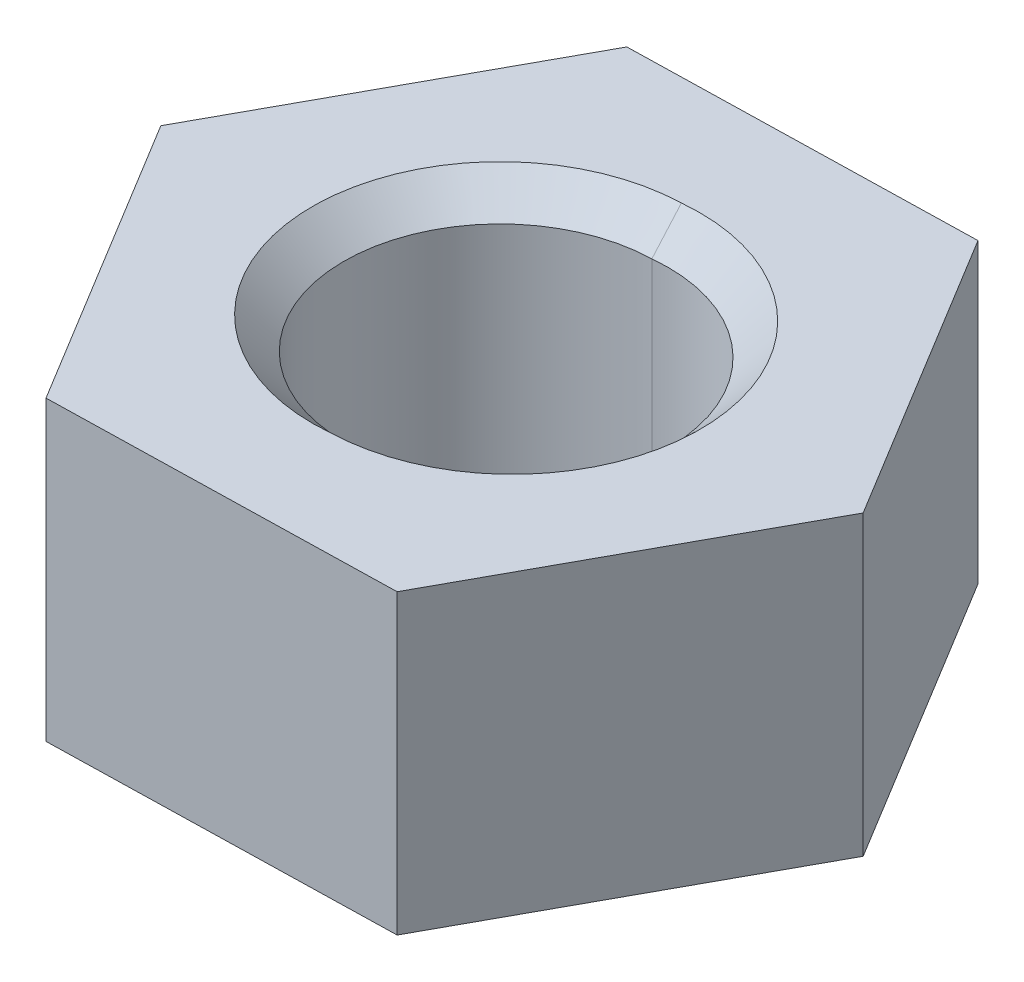
ISO-10303-21;
HEADER;
FILE_DESCRIPTION(('STEP AP214'),'2;1');
FILE_NAME('part.step','',(''),(''),'','','');
FILE_SCHEMA(('AUTOMOTIVE_DESIGN { 1 0 10303 214 1 1 1 1 }'));
ENDSEC;
DATA;
#1=APPLICATION_CONTEXT('core data for automotive mechanical design processes');
#2=APPLICATION_PROTOCOL_DEFINITION('international standard','automotive_design',2000,#1);
#3=PRODUCT_CONTEXT('',#1,'mechanical');
#4=PRODUCT('Part','Part','',(#3));
#5=PRODUCT_RELATED_PRODUCT_CATEGORY('part','',(#4));
#6=PRODUCT_DEFINITION_FORMATION('','',#4);
#7=PRODUCT_DEFINITION_CONTEXT('part definition',#1,'design');
#8=PRODUCT_DEFINITION('design','',#6,#7);
#9=PRODUCT_DEFINITION_SHAPE('','',#8);
#10=(LENGTH_UNIT() NAMED_UNIT(*) SI_UNIT(.MILLI.,.METRE.));
#11=(NAMED_UNIT(*) PLANE_ANGLE_UNIT() SI_UNIT($,.RADIAN.));
#12=(NAMED_UNIT(*) SI_UNIT($,.STERADIAN.) SOLID_ANGLE_UNIT());
#13=UNCERTAINTY_MEASURE_WITH_UNIT(LENGTH_MEASURE(1.E-05),#10,'distance_accuracy_value','');
#14=(GEOMETRIC_REPRESENTATION_CONTEXT(3) GLOBAL_UNCERTAINTY_ASSIGNED_CONTEXT((#13)) GLOBAL_UNIT_ASSIGNED_CONTEXT((#10,
#11,#12)) REPRESENTATION_CONTEXT('',''));
#15=CARTESIAN_POINT('',(0.,0.,0.));
#16=DIRECTION('',(0.,0.,1.));
#17=DIRECTION('',(1.,0.,0.));
#18=AXIS2_PLACEMENT_3D('',#15,#16,#17);
#19=CARTESIAN_POINT('',(-2.21675251568227,4.,4.05207867859814));
#20=DIRECTION('',(-0.0230092875344841,0.,-0.99973525129764));
#21=DIRECTION('',(-0.99973525129764,0.,0.0230092875344841));
#22=AXIS2_PLACEMENT_3D('',#19,#20,#21);
#23=PLANE('',#22);
#24=DIRECTION('',(0.99973525129764,0.,-0.0230092875344841));
#25=VECTOR('',#24,1.);
#26=CARTESIAN_POINT('',(-2.21675251568227,0.,4.05207867859814));
#27=LINE('',#26,#25);
#28=CARTESIAN_POINT('',(-2.21675251568227,0.,4.05207867859814));
#29=VERTEX_POINT('',#28);
#30=CARTESIAN_POINT('',(2.40082681595814,0.,3.94580333178298));
#31=VERTEX_POINT('',#30);
#32=EDGE_CURVE('E156',#29,#31,#27,.T.);
#33=ORIENTED_EDGE('',*,*,#32,.T.);
#34=DIRECTION('',(0.,-1.,0.));
#35=VECTOR('',#34,1.);
#36=CARTESIAN_POINT('',(2.40082681595814,4.,3.94580333178298));
#37=LINE('',#36,#35);
#38=CARTESIAN_POINT('',(2.40082681595814,4.,3.94580333178298));
#39=VERTEX_POINT('',#38);
#40=EDGE_CURVE('E185',#39,#31,#37,.T.);
#41=ORIENTED_EDGE('',*,*,#40,.F.);
#42=DIRECTION('',(0.99973525129764,0.,-0.0230092875344841));
#43=VECTOR('',#42,1.);
#44=CARTESIAN_POINT('',(-2.21675251568227,4.,4.05207867859814));
#45=LINE('',#44,#43);
#46=CARTESIAN_POINT('',(-2.21675251568227,4.,4.05207867859814));
#47=VERTEX_POINT('',#46);
#48=EDGE_CURVE('E174',#47,#39,#45,.T.);
#49=ORIENTED_EDGE('',*,*,#48,.F.);
#50=DIRECTION('',(0.,-1.,0.));
#51=VECTOR('',#50,1.);
#52=CARTESIAN_POINT('',(-2.21675251568227,4.,4.05207867859814));
#53=LINE('',#52,#51);
#54=EDGE_CURVE('E152',#47,#29,#53,.T.);
#55=ORIENTED_EDGE('',*,*,#54,.T.);
#56=EDGE_LOOP('',(#33,#41,#49,#55));
#57=FACE_BOUND('',#56,.T.);
#58=ADVANCED_FACE('F49',(#57),#23,.F.);
#59=CARTESIAN_POINT('',(2.40082681595814,4.,3.94580333178298));
#60=DIRECTION('',(-0.877300768449818,0.,-0.479940998120976));
#61=DIRECTION('',(-0.479940998120976,0.,0.877300768449818));
#62=AXIS2_PLACEMENT_3D('',#59,#60,#61);
#63=PLANE('',#62);
#64=DIRECTION('',(0.479940998120976,0.,-0.877300768449818));
#65=VECTOR('',#64,1.);
#66=CARTESIAN_POINT('',(2.40082681595814,0.,3.94580333178298));
#67=LINE('',#66,#65);
#68=CARTESIAN_POINT('',(4.6175793316404,0.,-0.106275346815166));
#69=VERTEX_POINT('',#68);
#70=EDGE_CURVE('E160',#31,#69,#67,.T.);
#71=ORIENTED_EDGE('',*,*,#70,.T.);
#72=DIRECTION('',(0.,-1.,0.));
#73=VECTOR('',#72,1.);
#74=CARTESIAN_POINT('',(4.6175793316404,4.,-0.106275346815166));
#75=LINE('',#74,#73);
#76=CARTESIAN_POINT('',(4.6175793316404,4.,-0.106275346815166));
#77=VERTEX_POINT('',#76);
#78=EDGE_CURVE('E181',#77,#69,#75,.T.);
#79=ORIENTED_EDGE('',*,*,#78,.F.);
#80=DIRECTION('',(0.479940998120976,0.,-0.877300768449818));
#81=VECTOR('',#80,1.);
#82=CARTESIAN_POINT('',(2.40082681595814,4.,3.94580333178298));
#83=LINE('',#82,#81);
#84=EDGE_CURVE('E115',#39,#77,#83,.T.);
#85=ORIENTED_EDGE('',*,*,#84,.F.);
#86=ORIENTED_EDGE('',*,*,#40,.T.);
#87=EDGE_LOOP('',(#71,#79,#85,#86));
#88=FACE_BOUND('',#87,.T.);
#89=ADVANCED_FACE('F208',(#88),#63,.F.);
#90=CARTESIAN_POINT('',(4.6175793316404,4.,-0.106275346815166));
#91=DIRECTION('',(-0.854291480915334,0.,0.519794253176664));
#92=DIRECTION('',(0.519794253176664,0.,0.854291480915334));
#93=AXIS2_PLACEMENT_3D('',#90,#91,#92);
#94=PLANE('',#93);
#95=DIRECTION('',(-0.519794253176664,0.,-0.854291480915334));
#96=VECTOR('',#95,1.);
#97=CARTESIAN_POINT('',(4.6175793316404,0.,-0.106275346815166));
#98=LINE('',#97,#96);
#99=CARTESIAN_POINT('',(2.21675251568227,0.,-4.05207867859814));
#100=VERTEX_POINT('',#99);
#101=EDGE_CURVE('E164',#69,#100,#98,.T.);
#102=ORIENTED_EDGE('',*,*,#101,.T.);
#103=DIRECTION('',(0.,-1.,0.));
#104=VECTOR('',#103,1.);
#105=CARTESIAN_POINT('',(2.21675251568227,4.,-4.05207867859814));
#106=LINE('',#105,#104);
#107=CARTESIAN_POINT('',(2.21675251568227,4.,-4.05207867859814));
#108=VERTEX_POINT('',#107);
#109=EDGE_CURVE('E145',#108,#100,#106,.T.);
#110=ORIENTED_EDGE('',*,*,#109,.F.);
#111=DIRECTION('',(-0.519794253176664,0.,-0.854291480915334));
#112=VECTOR('',#111,1.);
#113=CARTESIAN_POINT('',(4.6175793316404,4.,-0.106275346815166));
#114=LINE('',#113,#112);
#115=EDGE_CURVE('E131',#77,#108,#114,.T.);
#116=ORIENTED_EDGE('',*,*,#115,.F.);
#117=ORIENTED_EDGE('',*,*,#78,.T.);
#118=EDGE_LOOP('',(#102,#110,#116,#117));
#119=FACE_BOUND('',#118,.T.);
#120=ADVANCED_FACE('F213',(#119),#94,.F.);
#121=CARTESIAN_POINT('',(2.21675251568227,4.,-4.05207867859814));
#122=DIRECTION('',(0.0230092875344834,0.,0.99973525129764));
#123=DIRECTION('',(0.99973525129764,0.,-0.0230092875344834));
#124=AXIS2_PLACEMENT_3D('',#121,#122,#123);
#125=PLANE('',#124);
#126=DIRECTION('',(-0.99973525129764,0.,0.0230092875344833));
#127=VECTOR('',#126,1.);
#128=CARTESIAN_POINT('',(2.21675251568227,0.,-4.05207867859814));
#129=LINE('',#128,#127);
#130=CARTESIAN_POINT('',(-2.40082681595814,0.,-3.94580333178298));
#131=VERTEX_POINT('',#130);
#132=EDGE_CURVE('E141',#100,#131,#129,.T.);
#133=ORIENTED_EDGE('',*,*,#132,.T.);
#134=DIRECTION('',(0.,-1.,0.));
#135=VECTOR('',#134,1.);
#136=CARTESIAN_POINT('',(-2.40082681595814,4.,-3.94580333178298));
#137=LINE('',#136,#135);
#138=CARTESIAN_POINT('',(-2.40082681595814,4.,-3.94580333178298));
#139=VERTEX_POINT('',#138);
#140=EDGE_CURVE('E138',#139,#131,#137,.T.);
#141=ORIENTED_EDGE('',*,*,#140,.F.);
#142=DIRECTION('',(-0.99973525129764,0.,0.0230092875344833));
#143=VECTOR('',#142,1.);
#144=CARTESIAN_POINT('',(2.21675251568227,4.,-4.05207867859814));
#145=LINE('',#144,#143);
#146=EDGE_CURVE('E124',#108,#139,#145,.T.);
#147=ORIENTED_EDGE('',*,*,#146,.F.);
#148=ORIENTED_EDGE('',*,*,#109,.T.);
#149=EDGE_LOOP('',(#133,#141,#147,#148));
#150=FACE_BOUND('',#149,.T.);
#151=ADVANCED_FACE('F139',(#150),#125,.F.);
#152=CARTESIAN_POINT('',(-2.40082681595814,4.,-3.94580333178298));
#153=DIRECTION('',(0.877300768449818,0.,0.479940998120976));
#154=DIRECTION('',(0.479940998120977,0.,-0.877300768449818));
#155=AXIS2_PLACEMENT_3D('',#152,#153,#154);
#156=PLANE('',#155);
#157=DIRECTION('',(-0.479940998120976,0.,0.877300768449818));
#158=VECTOR('',#157,1.);
#159=CARTESIAN_POINT('',(-2.40082681595814,0.,-3.94580333178298));
#160=LINE('',#159,#158);
#161=CARTESIAN_POINT('',(-4.61757933164041,0.,0.106275346815165));
#162=VERTEX_POINT('',#161);
#163=EDGE_CURVE('E169',#131,#162,#160,.T.);
#164=ORIENTED_EDGE('',*,*,#163,.T.);
#165=DIRECTION('',(0.,-1.,0.));
#166=VECTOR('',#165,1.);
#167=CARTESIAN_POINT('',(-4.61757933164041,4.,0.106275346815165));
#168=LINE('',#167,#166);
#169=CARTESIAN_POINT('',(-4.61757933164041,4.,0.106275346815165));
#170=VERTEX_POINT('',#169);
#171=EDGE_CURVE('E146',#170,#162,#168,.T.);
#172=ORIENTED_EDGE('',*,*,#171,.F.);
#173=DIRECTION('',(-0.479940998120976,0.,0.877300768449818));
#174=VECTOR('',#173,1.);
#175=CARTESIAN_POINT('',(-2.40082681595814,4.,-3.94580333178298));
#176=LINE('',#175,#174);
#177=EDGE_CURVE('E128',#139,#170,#176,.T.);
#178=ORIENTED_EDGE('',*,*,#177,.F.);
#179=ORIENTED_EDGE('',*,*,#140,.T.);
#180=EDGE_LOOP('',(#164,#172,#178,#179));
#181=FACE_BOUND('',#180,.T.);
#182=ADVANCED_FACE('F148',(#181),#156,.F.);
#183=CARTESIAN_POINT('',(-4.61757933164041,4.,0.106275346815165));
#184=DIRECTION('',(0.854291480915334,0.,-0.519794253176663));
#185=DIRECTION('',(-0.519794253176663,0.,-0.854291480915334));
#186=AXIS2_PLACEMENT_3D('',#183,#184,#185);
#187=PLANE('',#186);
#188=DIRECTION('',(0.519794253176663,0.,0.854291480915334));
#189=VECTOR('',#188,1.);
#190=CARTESIAN_POINT('',(-4.61757933164041,0.,0.106275346815165));
#191=LINE('',#190,#189);
#192=EDGE_CURVE('E106',#162,#29,#191,.T.);
#193=ORIENTED_EDGE('',*,*,#192,.T.);
#194=ORIENTED_EDGE('',*,*,#54,.F.);
#195=DIRECTION('',(0.519794253176663,0.,0.854291480915334));
#196=VECTOR('',#195,1.);
#197=CARTESIAN_POINT('',(-4.61757933164041,4.,0.106275346815165));
#198=LINE('',#197,#196);
#199=EDGE_CURVE('E79',#170,#47,#198,.T.);
#200=ORIENTED_EDGE('',*,*,#199,.F.);
#201=ORIENTED_EDGE('',*,*,#171,.T.);
#202=EDGE_LOOP('',(#193,#194,#200,#201));
#203=FACE_BOUND('',#202,.T.);
#204=ADVANCED_FACE('F271',(#203),#187,.F.);
#205=CARTESIAN_POINT('',(0.,4.,0.));
#206=DIRECTION('',(0.,1.,0.));
#207=DIRECTION('',(0.,0.,1.));
#208=AXIS2_PLACEMENT_3D('',#205,#206,#207);
#209=PLANE('',#208);
#210=CARTESIAN_POINT('',(-0.132343684177535,4.,0.0288303601479331));
#211=DIRECTION('',(0.,1.,0.));
#212=DIRECTION('',(0.,0.,1.));
#213=AXIS2_PLACEMENT_3D('',#210,#211,#212);
#214=CIRCLE('',#213,2.525);
#215=CARTESIAN_POINT('',(-0.216069928484356,4.,-2.49478112263112));
#216=VERTEX_POINT('',#215);
#217=CARTESIAN_POINT('',(0.106300422318959,4.,2.54252763516625));
#218=VERTEX_POINT('',#217);
#219=EDGE_CURVE('E70',#216,#218,#214,.T.);
#220=ORIENTED_EDGE('',*,*,#219,.F.);
#221=CARTESIAN_POINT('',(0.0225741780121346,4.,0.0189161523871959));
#222=DIRECTION('',(0.,1.,0.));
#223=DIRECTION('',(0.,0.,1.));
#224=AXIS2_PLACEMENT_3D('',#221,#222,#223);
#225=CIRCLE('',#224,2.525);
#226=EDGE_CURVE('E234',#218,#216,#225,.T.);
#227=ORIENTED_EDGE('',*,*,#226,.F.);
#228=EDGE_LOOP('',(#220,#227));
#229=FACE_BOUND('',#228,.T.);
#230=ORIENTED_EDGE('',*,*,#48,.T.);
#231=ORIENTED_EDGE('',*,*,#84,.T.);
#232=ORIENTED_EDGE('',*,*,#115,.T.);
#233=ORIENTED_EDGE('',*,*,#146,.T.);
#234=ORIENTED_EDGE('',*,*,#177,.T.);
#235=ORIENTED_EDGE('',*,*,#199,.T.);
#236=EDGE_LOOP('',(#230,#231,#232,#233,#234,#235));
#237=FACE_BOUND('',#236,.T.);
#238=ADVANCED_FACE('F126',(#229,#237),#209,.T.);
#239=CARTESIAN_POINT('',(0.,0.,0.));
#240=DIRECTION('',(0.,1.,0.));
#241=DIRECTION('',(0.,0.,1.));
#242=AXIS2_PLACEMENT_3D('',#239,#240,#241);
#243=PLANE('',#242);
#244=CARTESIAN_POINT('',(0.0225741780121346,0.,0.0189161523871959));
#245=DIRECTION('',(0.,1.,0.));
#246=DIRECTION('',(0.,0.,1.));
#247=AXIS2_PLACEMENT_3D('',#244,#245,#246);
#248=CIRCLE('',#247,2.1);
#249=CARTESIAN_POINT('',(0.0791419846351026,0.,2.11815412919065));
#250=VERTEX_POINT('',#249);
#251=CARTESIAN_POINT('',(-0.188911490800501,0.,-2.07040761665552));
#252=VERTEX_POINT('',#251);
#253=EDGE_CURVE('E161',#250,#252,#248,.T.);
#254=ORIENTED_EDGE('',*,*,#253,.T.);
#255=CARTESIAN_POINT('',(-0.132343684177535,0.,0.0288303601479331));
#256=DIRECTION('',(0.,1.,0.));
#257=DIRECTION('',(0.,0.,1.));
#258=AXIS2_PLACEMENT_3D('',#255,#256,#257);
#259=CIRCLE('',#258,2.1);
#260=EDGE_CURVE('E246',#252,#250,#259,.T.);
#261=ORIENTED_EDGE('',*,*,#260,.T.);
#262=EDGE_LOOP('',(#254,#261));
#263=FACE_BOUND('',#262,.T.);
#264=ORIENTED_EDGE('',*,*,#32,.F.);
#265=ORIENTED_EDGE('',*,*,#192,.F.);
#266=ORIENTED_EDGE('',*,*,#163,.F.);
#267=ORIENTED_EDGE('',*,*,#132,.F.);
#268=ORIENTED_EDGE('',*,*,#101,.F.);
#269=ORIENTED_EDGE('',*,*,#70,.F.);
#270=EDGE_LOOP('',(#264,#265,#266,#267,#268,#269));
#271=FACE_BOUND('',#270,.T.);
#272=ADVANCED_FACE('F218',(#263,#271),#243,.F.);
#273=CARTESIAN_POINT('',(0.0225741780121346,4.,0.0189161523871959));
#274=DIRECTION('',(0.,1.,0.));
#275=DIRECTION('',(0.,0.,1.));
#276=AXIS2_PLACEMENT_3D('',#273,#274,#275);
#277=CYLINDRICAL_SURFACE('',#276,2.09999999999999);
#278=ORIENTED_EDGE('',*,*,#253,.F.);
#279=DIRECTION('',(0.,1.,0.));
#280=VECTOR('',#279,1.);
#281=CARTESIAN_POINT('',(0.079141984635102,1.7875,2.11815412919065));
#282=LINE('',#281,#280);
#283=CARTESIAN_POINT('',(0.0791419846351813,3.57499999999999,2.11815412919063));
#284=VERTEX_POINT('',#283);
#285=EDGE_CURVE('E238',#250,#284,#282,.T.);
#286=ORIENTED_EDGE('',*,*,#285,.T.);
#287=CARTESIAN_POINT('',(0.0225741780121346,3.57499999999999,0.0189161523871959));
#288=DIRECTION('',(0.,1.,0.));
#289=DIRECTION('',(0.,0.,1.));
#290=AXIS2_PLACEMENT_3D('',#287,#288,#289);
#291=CIRCLE('',#290,2.09999999999999);
#292=CARTESIAN_POINT('',(-0.188911490800377,3.57499999999999,-2.07040761665551));
#293=VERTEX_POINT('',#292);
#294=EDGE_CURVE('E230',#284,#293,#291,.T.);
#295=ORIENTED_EDGE('',*,*,#294,.T.);
#296=DIRECTION('',(0.,1.,0.));
#297=VECTOR('',#296,1.);
#298=CARTESIAN_POINT('',(-0.188911490800502,1.7875,-2.07040761665552));
#299=LINE('',#298,#297);
#300=EDGE_CURVE('E242',#293,#252,#299,.F.);
#301=ORIENTED_EDGE('',*,*,#300,.T.);
#302=EDGE_LOOP('',(#278,#286,#295,#301));
#303=FACE_BOUND('',#302,.T.);
#304=ADVANCED_FACE('F266',(#303),#277,.F.);
#305=CARTESIAN_POINT('',(0.0225741780121346,4.,0.0189161523871959));
#306=DIRECTION('',(0.,1.,0.));
#307=DIRECTION('',(0.,0.,1.));
#308=AXIS2_PLACEMENT_3D('',#305,#306,#307);
#309=CONICAL_SURFACE('',#308,2.525,0.78539816339745);
#310=ORIENTED_EDGE('',*,*,#226,.T.);
#311=CARTESIAN_POINT('',(-0.216082707701829,4.0002,-2.49498080868764));
#312=CARTESIAN_POINT('',(-0.211552278104718,3.92929628900369,-2.42418902331015));
#313=CARTESIAN_POINT('',(-0.207021730071753,3.85839443350777,-2.35339538727254));
#314=CARTESIAN_POINT('',(-0.197960397133545,3.71659443350776,-2.21180441386817));
#315=CARTESIAN_POINT('',(-0.193429612228302,3.64569628900369,-2.14100707650141));
#316=CARTESIAN_POINT('',(-0.188898708887206,3.57479999999999,-2.07020788847452));
#317=B_SPLINE_CURVE_WITH_KNOTS('',3,(#311,#312,#313,#314,#315,#316),.UNSPECIFIED.,.F.,.F.,(4,2,
4),(0.,0.300888751758901,0.601777503555669),.UNSPECIFIED.);
#318=EDGE_CURVE('E11',#216,#293,#317,.T.);
#319=ORIENTED_EDGE('',*,*,#318,.T.);
#320=ORIENTED_EDGE('',*,*,#294,.F.);
#321=CARTESIAN_POINT('',(0.0791292027218085,3.57479999999999,2.11795440100965));
#322=CARTESIAN_POINT('',(0.0836601060629081,3.64569628900373,2.18875358903658));
#323=CARTESIAN_POINT('',(0.0881908909681539,3.71659443350786,2.25955092640339));
#324=CARTESIAN_POINT('',(0.0972522239063676,3.85839443350795,2.40114189980785));
#325=CARTESIAN_POINT('',(0.101782771939336,3.92929628900392,2.47193553584551));
#326=CARTESIAN_POINT('',(0.10631320153645,4.00020000000028,2.54272732122305));
#327=B_SPLINE_CURVE_WITH_KNOTS('',3,(#321,#322,#323,#324,#325,#326),.UNSPECIFIED.,.F.,.F.,(4,2,
4),(0.,0.300888751796962,0.601777503556057),.UNSPECIFIED.);
#328=EDGE_CURVE('E63',#284,#218,#327,.T.);
#329=ORIENTED_EDGE('',*,*,#328,.T.);
#330=EDGE_LOOP('',(#310,#319,#320,#329));
#331=FACE_BOUND('',#330,.T.);
#332=ADVANCED_FACE('F192',(#331),#309,.F.);
#333=CARTESIAN_POINT('',(-0.132343684177535,4.,0.0288303601479331));
#334=DIRECTION('',(0.,1.,0.));
#335=DIRECTION('',(0.,0.,1.));
#336=AXIS2_PLACEMENT_3D('',#333,#334,#335);
#337=CONICAL_SURFACE('',#336,2.525,0.78539816339745);
#338=ORIENTED_EDGE('',*,*,#219,.T.);
#339=ORIENTED_EDGE('',*,*,#328,.F.);
#340=CARTESIAN_POINT('',(-0.132343684177535,3.57499999999999,0.0288303601479331));
#341=DIRECTION('',(0.,1.,0.));
#342=DIRECTION('',(0.,0.,1.));
#343=AXIS2_PLACEMENT_3D('',#340,#341,#342);
#344=CIRCLE('',#343,2.09999999999999);
#345=EDGE_CURVE('E250',#293,#284,#344,.T.);
#346=ORIENTED_EDGE('',*,*,#345,.F.);
#347=ORIENTED_EDGE('',*,*,#318,.F.);
#348=EDGE_LOOP('',(#338,#339,#346,#347));
#349=FACE_BOUND('',#348,.T.);
#350=ADVANCED_FACE('F196',(#349),#337,.F.);
#351=CARTESIAN_POINT('',(-0.132343684177535,4.,0.0288303601479331));
#352=DIRECTION('',(0.,1.,0.));
#353=DIRECTION('',(0.,0.,1.));
#354=AXIS2_PLACEMENT_3D('',#351,#352,#353);
#355=CYLINDRICAL_SURFACE('',#354,2.09999999999999);
#356=ORIENTED_EDGE('',*,*,#260,.F.);
#357=ORIENTED_EDGE('',*,*,#300,.F.);
#358=ORIENTED_EDGE('',*,*,#345,.T.);
#359=ORIENTED_EDGE('',*,*,#285,.F.);
#360=EDGE_LOOP('',(#356,#357,#358,#359));
#361=FACE_BOUND('',#360,.T.);
#362=ADVANCED_FACE('F199',(#361),#355,.F.);
#363=CLOSED_SHELL('',(#58,#89,#120,#151,#182,#204,#238,#272,#304,#332,#350,#362));
#364=MANIFOLD_SOLID_BREP('B2',#363);
#365=ADVANCED_BREP_SHAPE_REPRESENTATION('',(#18,#364),#14);
#366=SHAPE_DEFINITION_REPRESENTATION(#9,#365);
ENDSEC;
END-ISO-10303-21;
